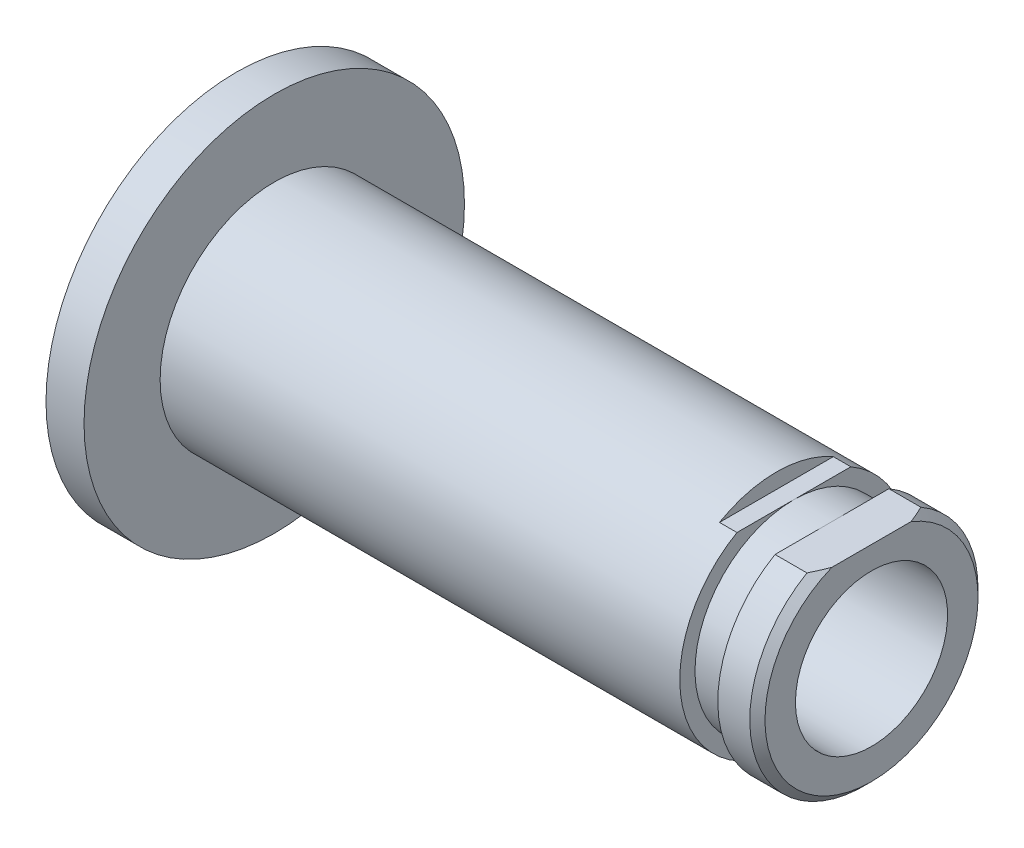
ISO-10303-21;
HEADER;
FILE_DESCRIPTION(('STEP AP214'),'2;1');
FILE_NAME('part.step','',(''),(''),'','','');
FILE_SCHEMA(('AUTOMOTIVE_DESIGN { 1 0 10303 214 1 1 1 1 }'));
ENDSEC;
DATA;
#1=APPLICATION_CONTEXT('core data for automotive mechanical design processes');
#2=APPLICATION_PROTOCOL_DEFINITION('international standard','automotive_design',2000,#1);
#3=PRODUCT_CONTEXT('',#1,'mechanical');
#4=PRODUCT('Part','Part','',(#3));
#5=PRODUCT_RELATED_PRODUCT_CATEGORY('part','',(#4));
#6=PRODUCT_DEFINITION_FORMATION('','',#4);
#7=PRODUCT_DEFINITION_CONTEXT('part definition',#1,'design');
#8=PRODUCT_DEFINITION('design','',#6,#7);
#9=PRODUCT_DEFINITION_SHAPE('','',#8);
#10=(LENGTH_UNIT() NAMED_UNIT(*) SI_UNIT(.MILLI.,.METRE.));
#11=(NAMED_UNIT(*) PLANE_ANGLE_UNIT() SI_UNIT($,.RADIAN.));
#12=(NAMED_UNIT(*) SI_UNIT($,.STERADIAN.) SOLID_ANGLE_UNIT());
#13=UNCERTAINTY_MEASURE_WITH_UNIT(LENGTH_MEASURE(1.E-05),#10,'distance_accuracy_value','');
#14=(GEOMETRIC_REPRESENTATION_CONTEXT(3) GLOBAL_UNCERTAINTY_ASSIGNED_CONTEXT((#13)) GLOBAL_UNIT_ASSIGNED_CONTEXT((#10,
#11,#12)) REPRESENTATION_CONTEXT('',''));
#15=CARTESIAN_POINT('',(0.,0.,0.));
#16=DIRECTION('',(0.,0.,1.));
#17=DIRECTION('',(1.,0.,0.));
#18=AXIS2_PLACEMENT_3D('',#15,#16,#17);
#19=CARTESIAN_POINT('',(0.,0.,0.));
#20=DIRECTION('',(-1.,0.,0.));
#21=DIRECTION('',(0.,0.,1.));
#22=AXIS2_PLACEMENT_3D('',#19,#20,#21);
#23=CYLINDRICAL_SURFACE('',#22,19.05);
#24=CARTESIAN_POINT('',(6.35,0.,0.));
#25=DIRECTION('',(-1.,0.,0.));
#26=DIRECTION('',(0.,0.,1.));
#27=AXIS2_PLACEMENT_3D('',#24,#25,#26);
#28=CIRCLE('',#27,19.05);
#29=CARTESIAN_POINT('',(6.35,0.,19.05));
#30=VERTEX_POINT('',#29);
#31=EDGE_CURVE('E138',#30,#30,#28,.T.);
#32=ORIENTED_EDGE('',*,*,#31,.F.);
#33=EDGE_LOOP('',(#32));
#34=FACE_BOUND('',#33,.T.);
#35=CARTESIAN_POINT('',(93.091,0.,0.));
#36=DIRECTION('',(1.,0.,0.));
#37=DIRECTION('',(0.,0.,-1.));
#38=AXIS2_PLACEMENT_3D('',#35,#36,#37);
#39=CIRCLE('',#38,19.05);
#40=CARTESIAN_POINT('',(93.091,16.51,9.50380976240581));
#41=VERTEX_POINT('',#40);
#42=CARTESIAN_POINT('',(93.091,16.51,-9.50380976240581));
#43=VERTEX_POINT('',#42);
#44=EDGE_CURVE('E107',#41,#43,#39,.T.);
#45=ORIENTED_EDGE('',*,*,#44,.F.);
#46=DIRECTION('',(-1.,0.,0.));
#47=VECTOR('',#46,1.);
#48=CARTESIAN_POINT('',(0.,16.51,9.50380976240581));
#49=LINE('',#48,#47);
#50=CARTESIAN_POINT('',(90.17,16.51,9.50380976240581));
#51=VERTEX_POINT('',#50);
#52=EDGE_CURVE('E117',#41,#51,#49,.T.);
#53=ORIENTED_EDGE('',*,*,#52,.T.);
#54=CARTESIAN_POINT('',(90.17,0.,0.));
#55=DIRECTION('',(-1.,0.,0.));
#56=DIRECTION('',(0.,0.,1.));
#57=AXIS2_PLACEMENT_3D('',#54,#55,#56);
#58=CIRCLE('',#57,19.05);
#59=CARTESIAN_POINT('',(90.17,16.51,-9.50380976240581));
#60=VERTEX_POINT('',#59);
#61=EDGE_CURVE('E98',#51,#60,#58,.T.);
#62=ORIENTED_EDGE('',*,*,#61,.T.);
#63=DIRECTION('',(-1.,0.,0.));
#64=VECTOR('',#63,1.);
#65=CARTESIAN_POINT('',(0.,16.51,-9.50380976240581));
#66=LINE('',#65,#64);
#67=EDGE_CURVE('E113',#60,#43,#66,.F.);
#68=ORIENTED_EDGE('',*,*,#67,.T.);
#69=EDGE_LOOP('',(#45,#53,#62,#68));
#70=FACE_BOUND('',#69,.T.);
#71=ADVANCED_FACE('F37',(#34,#70),#23,.T.);
#72=CARTESIAN_POINT('',(99.441,16.51,-9.50380976240581));
#73=VERTEX_POINT('',#72);
#74=CARTESIAN_POINT('',(104.775,16.51,-9.50380976240581));
#75=VERTEX_POINT('',#74);
#76=EDGE_CURVE('E104',#73,#75,#66,.F.);
#77=ORIENTED_EDGE('',*,*,#76,.T.);
#78=CARTESIAN_POINT('',(104.775,0.,0.));
#79=DIRECTION('',(-1.,0.,0.));
#80=DIRECTION('',(0.,0.,1.));
#81=AXIS2_PLACEMENT_3D('',#78,#79,#80);
#82=CIRCLE('',#81,19.05);
#83=CARTESIAN_POINT('',(104.775,16.51,9.50380976240581));
#84=VERTEX_POINT('',#83);
#85=EDGE_CURVE('E151',#75,#84,#82,.T.);
#86=ORIENTED_EDGE('',*,*,#85,.T.);
#87=CARTESIAN_POINT('',(99.441,16.51,9.50380976240581));
#88=VERTEX_POINT('',#87);
#89=EDGE_CURVE('E106',#84,#88,#49,.T.);
#90=ORIENTED_EDGE('',*,*,#89,.T.);
#91=CARTESIAN_POINT('',(99.441,0.,0.));
#92=DIRECTION('',(-1.,0.,0.));
#93=DIRECTION('',(0.,0.,1.));
#94=AXIS2_PLACEMENT_3D('',#91,#92,#93);
#95=CIRCLE('',#94,19.05);
#96=EDGE_CURVE('E92',#73,#88,#95,.T.);
#97=ORIENTED_EDGE('',*,*,#96,.F.);
#98=EDGE_LOOP('',(#77,#86,#90,#97));
#99=FACE_BOUND('',#98,.T.);
#100=ADVANCED_FACE('F102',(#99),#23,.T.);
#101=CARTESIAN_POINT('',(-165.209678252641,16.51,79.4478680549418));
#102=DIRECTION('',(0.,-1.,0.));
#103=DIRECTION('',(0.,0.,-1.));
#104=AXIS2_PLACEMENT_3D('',#101,#102,#103);
#105=PLANE('',#104);
#106=DIRECTION('',(0.,0.,1.));
#107=VECTOR('',#106,1.);
#108=CARTESIAN_POINT('',(93.091,16.51,79.4478680549418));
#109=LINE('',#108,#107);
#110=CARTESIAN_POINT('',(93.091,16.51,0.));
#111=VERTEX_POINT('',#110);
#112=EDGE_CURVE('E150',#43,#111,#109,.T.);
#113=ORIENTED_EDGE('',*,*,#112,.F.);
#114=ORIENTED_EDGE('',*,*,#67,.F.);
#115=DIRECTION('',(0.,0.,-1.));
#116=VECTOR('',#115,1.);
#117=CARTESIAN_POINT('',(90.17,16.51,79.4478680549418));
#118=LINE('',#117,#116);
#119=EDGE_CURVE('E114',#51,#60,#118,.T.);
#120=ORIENTED_EDGE('',*,*,#119,.F.);
#121=ORIENTED_EDGE('',*,*,#52,.F.);
#122=EDGE_CURVE('E148',#111,#41,#109,.T.);
#123=ORIENTED_EDGE('',*,*,#122,.F.);
#124=EDGE_LOOP('',(#113,#114,#120,#121,#123));
#125=FACE_BOUND('',#124,.T.);
#126=ADVANCED_FACE('F160',(#125),#105,.F.);
#127=ORIENTED_EDGE('',*,*,#89,.F.);
#128=CARTESIAN_POINT('',(104.775,16.51,9.50380976240581));
#129=CARTESIAN_POINT('',(104.893019816345,16.51,9.26722853761786));
#130=CARTESIAN_POINT('',(105.008407556862,16.51,9.02931834614094));
#131=CARTESIAN_POINT('',(105.233237204593,16.51,8.55091605419112));
#132=CARTESIAN_POINT('',(105.34268332118,16.51,8.31042593005109));
#133=CARTESIAN_POINT('',(105.555127809995,16.51,7.82658081372098));
#134=CARTESIAN_POINT('',(105.658125660527,16.51,7.5832255916179));
#135=CARTESIAN_POINT('',(105.857056817734,16.51,7.09344423809944));
#136=CARTESIAN_POINT('',(105.952984994598,16.51,6.84701602557759));
#137=CARTESIAN_POINT('',(106.045,16.51,6.59911357683747));
#138=B_SPLINE_CURVE_WITH_KNOTS('',3,(#128,#129,#130,#131,#132,#133,#134,#135,#136,#137),
.UNSPECIFIED.,.F.,.F.,(4,2,2,2,4),(0.,0.793158706189417,1.58574795866996,2.37840125284934,
3.17162415242452),.UNSPECIFIED.);
#139=CARTESIAN_POINT('',(106.045,16.51,6.59911357683747));
#140=VERTEX_POINT('',#139);
#141=EDGE_CURVE('E46',#84,#140,#138,.T.);
#142=ORIENTED_EDGE('',*,*,#141,.T.);
#143=DIRECTION('',(0.,0.,1.));
#144=VECTOR('',#143,1.);
#145=CARTESIAN_POINT('',(106.045,16.51,0.));
#146=LINE('',#145,#144);
#147=CARTESIAN_POINT('',(106.045,16.51,-6.59911357683747));
#148=VERTEX_POINT('',#147);
#149=EDGE_CURVE('E144',#148,#140,#146,.T.);
#150=ORIENTED_EDGE('',*,*,#149,.F.);
#151=CARTESIAN_POINT('',(106.045,16.51,-6.59911357683747));
#152=CARTESIAN_POINT('',(105.952984994598,16.51,-6.84701602557759));
#153=CARTESIAN_POINT('',(105.857056817734,16.51,-7.09344423809944));
#154=CARTESIAN_POINT('',(105.658125660527,16.51,-7.5832255916179));
#155=CARTESIAN_POINT('',(105.555127809995,16.51,-7.82658081372098));
#156=CARTESIAN_POINT('',(105.34268332118,16.51,-8.31042593005109));
#157=CARTESIAN_POINT('',(105.233237204593,16.51,-8.55091605419112));
#158=CARTESIAN_POINT('',(105.008407556862,16.51,-9.02931834614094));
#159=CARTESIAN_POINT('',(104.893019816345,16.51,-9.26722853761786));
#160=CARTESIAN_POINT('',(104.775,16.51,-9.50380976240581));
#161=B_SPLINE_CURVE_WITH_KNOTS('',3,(#151,#152,#153,#154,#155,#156,#157,#158,#159,#160),
.UNSPECIFIED.,.F.,.F.,(4,2,2,2,4),(0.,0.793222899575183,1.58587619375456,2.37846544623511,
3.17162415242452),.UNSPECIFIED.);
#162=EDGE_CURVE('E112',#148,#75,#161,.T.);
#163=ORIENTED_EDGE('',*,*,#162,.T.);
#164=ORIENTED_EDGE('',*,*,#76,.F.);
#165=DIRECTION('',(0.,0.,-1.));
#166=VECTOR('',#165,1.);
#167=CARTESIAN_POINT('',(99.441,16.51,79.4478680549418));
#168=LINE('',#167,#166);
#169=CARTESIAN_POINT('',(99.441,16.51,0.));
#170=VERTEX_POINT('',#169);
#171=EDGE_CURVE('E88',#170,#73,#168,.T.);
#172=ORIENTED_EDGE('',*,*,#171,.F.);
#173=EDGE_CURVE('E97',#88,#170,#168,.T.);
#174=ORIENTED_EDGE('',*,*,#173,.F.);
#175=EDGE_LOOP('',(#127,#142,#150,#163,#164,#172,#174));
#176=FACE_BOUND('',#175,.T.);
#177=ADVANCED_FACE('F110',(#176),#105,.F.);
#178=CARTESIAN_POINT('',(0.,0.,0.));
#179=DIRECTION('',(-1.,0.,0.));
#180=DIRECTION('',(0.,0.,1.));
#181=AXIS2_PLACEMENT_3D('',#178,#179,#180);
#182=CYLINDRICAL_SURFACE('',#181,31.75);
#183=CARTESIAN_POINT('',(0.,0.,0.));
#184=DIRECTION('',(-1.,0.,0.));
#185=DIRECTION('',(0.,0.,1.));
#186=AXIS2_PLACEMENT_3D('',#183,#184,#185);
#187=CIRCLE('',#186,31.75);
#188=CARTESIAN_POINT('',(0.,0.,31.75));
#189=VERTEX_POINT('',#188);
#190=EDGE_CURVE('E123',#189,#189,#187,.T.);
#191=ORIENTED_EDGE('',*,*,#190,.F.);
#192=EDGE_LOOP('',(#191));
#193=FACE_BOUND('',#192,.T.);
#194=CARTESIAN_POINT('',(6.35,0.,0.));
#195=DIRECTION('',(-1.,0.,0.));
#196=DIRECTION('',(0.,0.,1.));
#197=AXIS2_PLACEMENT_3D('',#194,#195,#196);
#198=CIRCLE('',#197,31.75);
#199=CARTESIAN_POINT('',(6.35,0.,31.75));
#200=VERTEX_POINT('',#199);
#201=EDGE_CURVE('E141',#200,#200,#198,.T.);
#202=ORIENTED_EDGE('',*,*,#201,.T.);
#203=EDGE_LOOP('',(#202));
#204=FACE_BOUND('',#203,.T.);
#205=ADVANCED_FACE('F198',(#193,#204),#182,.T.);
#206=CARTESIAN_POINT('',(6.35,31.75,0.));
#207=DIRECTION('',(-1.,0.,0.));
#208=DIRECTION('',(0.,0.,1.));
#209=AXIS2_PLACEMENT_3D('',#206,#207,#208);
#210=PLANE('',#209);
#211=ORIENTED_EDGE('',*,*,#201,.F.);
#212=EDGE_LOOP('',(#211));
#213=FACE_BOUND('',#212,.T.);
#214=ORIENTED_EDGE('',*,*,#31,.T.);
#215=EDGE_LOOP('',(#214));
#216=FACE_BOUND('',#215,.T.);
#217=ADVANCED_FACE('F193',(#213,#216),#210,.F.);
#218=CARTESIAN_POINT('',(106.045,19.05,0.));
#219=DIRECTION('',(-1.,0.,0.));
#220=DIRECTION('',(0.,0.,1.));
#221=AXIS2_PLACEMENT_3D('',#218,#219,#220);
#222=PLANE('',#221);
#223=ORIENTED_EDGE('',*,*,#149,.T.);
#224=CARTESIAN_POINT('',(106.045,0.,0.));
#225=DIRECTION('',(-1.,0.,0.));
#226=DIRECTION('',(0.,0.,1.));
#227=AXIS2_PLACEMENT_3D('',#224,#225,#226);
#228=CIRCLE('',#227,17.78);
#229=EDGE_CURVE('E13',#140,#148,#228,.F.);
#230=ORIENTED_EDGE('',*,*,#229,.T.);
#231=EDGE_LOOP('',(#223,#230));
#232=FACE_BOUND('',#231,.T.);
#233=CARTESIAN_POINT('',(106.045,0.,0.));
#234=DIRECTION('',(-1.,0.,0.));
#235=DIRECTION('',(0.,0.,1.));
#236=AXIS2_PLACEMENT_3D('',#233,#234,#235);
#237=CIRCLE('',#236,12.7);
#238=CARTESIAN_POINT('',(106.045,0.,12.7));
#239=VERTEX_POINT('',#238);
#240=EDGE_CURVE('E135',#239,#239,#237,.T.);
#241=ORIENTED_EDGE('',*,*,#240,.T.);
#242=EDGE_LOOP('',(#241));
#243=FACE_BOUND('',#242,.T.);
#244=ADVANCED_FACE('F189',(#232,#243),#222,.F.);
#245=CARTESIAN_POINT('',(0.,0.,0.));
#246=DIRECTION('',(-1.,0.,0.));
#247=DIRECTION('',(0.,0.,1.));
#248=AXIS2_PLACEMENT_3D('',#245,#246,#247);
#249=CYLINDRICAL_SURFACE('',#248,12.7);
#250=ORIENTED_EDGE('',*,*,#240,.F.);
#251=EDGE_LOOP('',(#250));
#252=FACE_BOUND('',#251,.T.);
#253=CARTESIAN_POINT('',(44.45,0.,0.));
#254=DIRECTION('',(-1.,0.,0.));
#255=DIRECTION('',(0.,0.,1.));
#256=AXIS2_PLACEMENT_3D('',#253,#254,#255);
#257=CIRCLE('',#256,12.7);
#258=CARTESIAN_POINT('',(44.45,0.,12.7));
#259=VERTEX_POINT('',#258);
#260=EDGE_CURVE('E132',#259,#259,#257,.T.);
#261=ORIENTED_EDGE('',*,*,#260,.T.);
#262=EDGE_LOOP('',(#261));
#263=FACE_BOUND('',#262,.T.);
#264=ADVANCED_FACE('F185',(#252,#263),#249,.F.);
#265=CARTESIAN_POINT('',(44.45,12.7,0.));
#266=DIRECTION('',(-1.,0.,0.));
#267=DIRECTION('',(0.,0.,1.));
#268=AXIS2_PLACEMENT_3D('',#265,#266,#267);
#269=PLANE('',#268);
#270=ORIENTED_EDGE('',*,*,#260,.F.);
#271=EDGE_LOOP('',(#270));
#272=FACE_BOUND('',#271,.T.);
#273=CARTESIAN_POINT('',(44.45,0.,0.));
#274=DIRECTION('',(-1.,0.,0.));
#275=DIRECTION('',(0.,0.,1.));
#276=AXIS2_PLACEMENT_3D('',#273,#274,#275);
#277=CIRCLE('',#276,6.477);
#278=CARTESIAN_POINT('',(44.45,0.,6.477));
#279=VERTEX_POINT('',#278);
#280=EDGE_CURVE('E129',#279,#279,#277,.T.);
#281=ORIENTED_EDGE('',*,*,#280,.T.);
#282=EDGE_LOOP('',(#281));
#283=FACE_BOUND('',#282,.T.);
#284=ADVANCED_FACE('F181',(#272,#283),#269,.F.);
#285=CARTESIAN_POINT('',(0.,0.,0.));
#286=DIRECTION('',(-1.,0.,0.));
#287=DIRECTION('',(0.,0.,1.));
#288=AXIS2_PLACEMENT_3D('',#285,#286,#287);
#289=CYLINDRICAL_SURFACE('',#288,6.477);
#290=ORIENTED_EDGE('',*,*,#280,.F.);
#291=EDGE_LOOP('',(#290));
#292=FACE_BOUND('',#291,.T.);
#293=CARTESIAN_POINT('',(0.,0.,0.));
#294=DIRECTION('',(-1.,0.,0.));
#295=DIRECTION('',(0.,0.,1.));
#296=AXIS2_PLACEMENT_3D('',#293,#294,#295);
#297=CIRCLE('',#296,6.477);
#298=CARTESIAN_POINT('',(0.,0.,6.477));
#299=VERTEX_POINT('',#298);
#300=EDGE_CURVE('E126',#299,#299,#297,.T.);
#301=ORIENTED_EDGE('',*,*,#300,.T.);
#302=EDGE_LOOP('',(#301));
#303=FACE_BOUND('',#302,.T.);
#304=ADVANCED_FACE('F177',(#292,#303),#289,.F.);
#305=CARTESIAN_POINT('',(0.,31.75,0.));
#306=DIRECTION('',(1.,0.,0.));
#307=DIRECTION('',(0.,0.,-1.));
#308=AXIS2_PLACEMENT_3D('',#305,#306,#307);
#309=PLANE('',#308);
#310=ORIENTED_EDGE('',*,*,#300,.F.);
#311=EDGE_LOOP('',(#310));
#312=FACE_BOUND('',#311,.T.);
#313=ORIENTED_EDGE('',*,*,#190,.T.);
#314=EDGE_LOOP('',(#313));
#315=FACE_BOUND('',#314,.T.);
#316=ADVANCED_FACE('F173',(#312,#315),#309,.F.);
#317=CARTESIAN_POINT('',(90.17,31.75,0.));
#318=DIRECTION('',(-1.,0.,0.));
#319=DIRECTION('',(0.,0.,1.));
#320=AXIS2_PLACEMENT_3D('',#317,#318,#319);
#321=PLANE('',#320);
#322=ORIENTED_EDGE('',*,*,#119,.T.);
#323=ORIENTED_EDGE('',*,*,#61,.F.);
#324=EDGE_LOOP('',(#322,#323));
#325=FACE_BOUND('',#324,.T.);
#326=ADVANCED_FACE('F168',(#325),#321,.F.);
#327=CARTESIAN_POINT('',(93.091,16.51,0.));
#328=DIRECTION('',(1.,0.,0.));
#329=DIRECTION('',(0.,0.,-1.));
#330=AXIS2_PLACEMENT_3D('',#327,#328,#329);
#331=PLANE('',#330);
#332=ORIENTED_EDGE('',*,*,#44,.T.);
#333=ORIENTED_EDGE('',*,*,#112,.T.);
#334=CARTESIAN_POINT('',(93.091,0.,0.));
#335=DIRECTION('',(-1.,0.,0.));
#336=DIRECTION('',(0.,0.,1.));
#337=AXIS2_PLACEMENT_3D('',#334,#335,#336);
#338=CIRCLE('',#337,16.51);
#339=EDGE_CURVE('E108',#111,#111,#338,.T.);
#340=ORIENTED_EDGE('',*,*,#339,.T.);
#341=ORIENTED_EDGE('',*,*,#122,.T.);
#342=EDGE_LOOP('',(#332,#333,#340,#341));
#343=FACE_BOUND('',#342,.T.);
#344=ADVANCED_FACE('F172',(#343),#331,.T.);
#345=CARTESIAN_POINT('',(99.441,19.685,0.));
#346=DIRECTION('',(-1.,0.,0.));
#347=DIRECTION('',(0.,0.,1.));
#348=AXIS2_PLACEMENT_3D('',#345,#346,#347);
#349=PLANE('',#348);
#350=ORIENTED_EDGE('',*,*,#96,.T.);
#351=ORIENTED_EDGE('',*,*,#173,.T.);
#352=CARTESIAN_POINT('',(99.441,0.,0.));
#353=DIRECTION('',(-1.,0.,0.));
#354=DIRECTION('',(0.,0.,1.));
#355=AXIS2_PLACEMENT_3D('',#352,#353,#354);
#356=CIRCLE('',#355,16.51);
#357=EDGE_CURVE('E95',#170,#170,#356,.T.);
#358=ORIENTED_EDGE('',*,*,#357,.F.);
#359=ORIENTED_EDGE('',*,*,#171,.T.);
#360=EDGE_LOOP('',(#350,#351,#358,#359));
#361=FACE_BOUND('',#360,.T.);
#362=ADVANCED_FACE('F90',(#361),#349,.T.);
#363=CARTESIAN_POINT('',(0.,0.,0.));
#364=DIRECTION('',(-1.,0.,0.));
#365=DIRECTION('',(0.,0.,1.));
#366=AXIS2_PLACEMENT_3D('',#363,#364,#365);
#367=CYLINDRICAL_SURFACE('',#366,16.51);
#368=ORIENTED_EDGE('',*,*,#339,.F.);
#369=EDGE_LOOP('',(#368));
#370=FACE_BOUND('',#369,.T.);
#371=ORIENTED_EDGE('',*,*,#357,.T.);
#372=EDGE_LOOP('',(#371));
#373=FACE_BOUND('',#372,.T.);
#374=ADVANCED_FACE('F166',(#370,#373),#367,.T.);
#375=CARTESIAN_POINT('',(104.775,0.,0.));
#376=DIRECTION('',(-1.,0.,0.));
#377=DIRECTION('',(0.,0.,1.));
#378=AXIS2_PLACEMENT_3D('',#375,#376,#377);
#379=CONICAL_SURFACE('',#378,19.05,0.78539816339745);
#380=ORIENTED_EDGE('',*,*,#162,.F.);
#381=ORIENTED_EDGE('',*,*,#229,.F.);
#382=ORIENTED_EDGE('',*,*,#141,.F.);
#383=ORIENTED_EDGE('',*,*,#85,.F.);
#384=EDGE_LOOP('',(#380,#381,#382,#383));
#385=FACE_BOUND('',#384,.T.);
#386=ADVANCED_FACE('F39',(#385),#379,.T.);
#387=CLOSED_SHELL('',(#71,#100,#126,#177,#205,#217,#244,#264,#284,#304,#316,#326,#344,#362,#374,#386));
#388=MANIFOLD_SOLID_BREP('B2',#387);
#389=ADVANCED_BREP_SHAPE_REPRESENTATION('',(#18,#388),#14);
#390=SHAPE_DEFINITION_REPRESENTATION(#9,#389);
ENDSEC;
END-ISO-10303-21;
